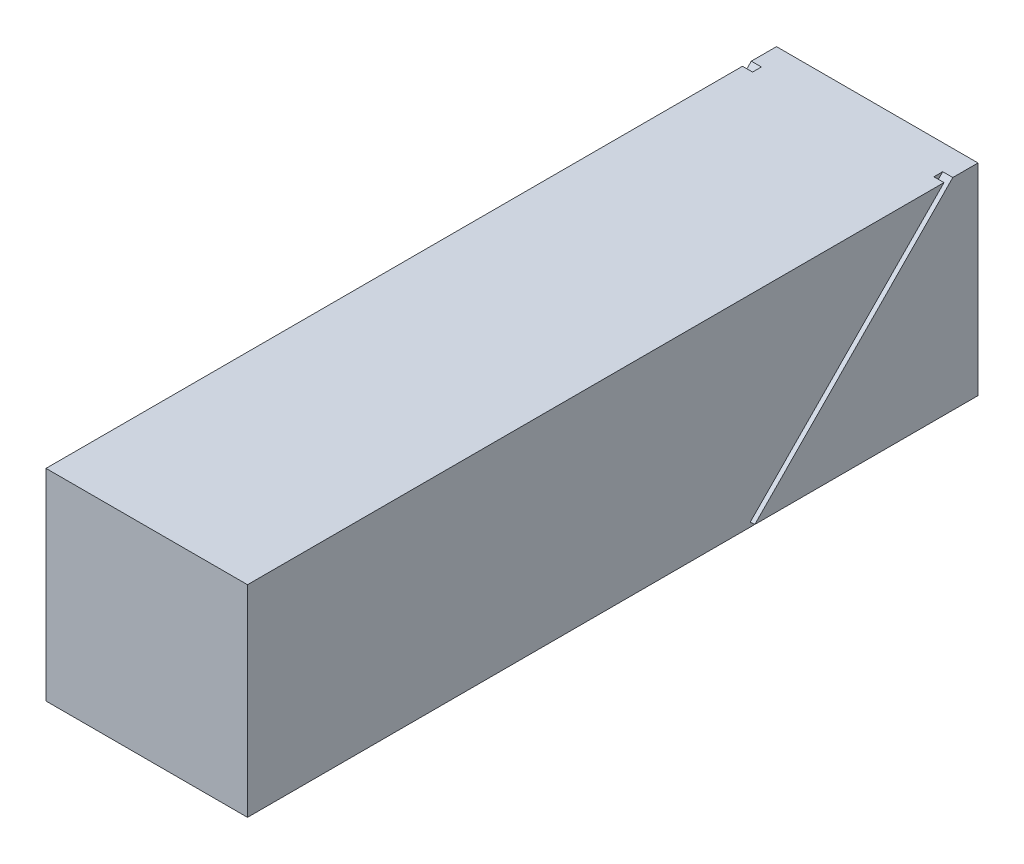
ISO-10303-21;
HEADER;
FILE_DESCRIPTION(('STEP AP214'),'2;1');
FILE_NAME('part.step','',(''),(''),'','','');
FILE_SCHEMA(('AUTOMOTIVE_DESIGN { 1 0 10303 214 1 1 1 1 }'));
ENDSEC;
DATA;
#1=APPLICATION_CONTEXT('core data for automotive mechanical design processes');
#2=APPLICATION_PROTOCOL_DEFINITION('international standard','automotive_design',2000,#1);
#3=PRODUCT_CONTEXT('',#1,'mechanical');
#4=PRODUCT('Part','Part','',(#3));
#5=PRODUCT_RELATED_PRODUCT_CATEGORY('part','',(#4));
#6=PRODUCT_DEFINITION_FORMATION('','',#4);
#7=PRODUCT_DEFINITION_CONTEXT('part definition',#1,'design');
#8=PRODUCT_DEFINITION('design','',#6,#7);
#9=PRODUCT_DEFINITION_SHAPE('','',#8);
#10=(LENGTH_UNIT() NAMED_UNIT(*) SI_UNIT(.MILLI.,.METRE.));
#11=(NAMED_UNIT(*) PLANE_ANGLE_UNIT() SI_UNIT($,.RADIAN.));
#12=(NAMED_UNIT(*) SI_UNIT($,.STERADIAN.) SOLID_ANGLE_UNIT());
#13=UNCERTAINTY_MEASURE_WITH_UNIT(LENGTH_MEASURE(1.E-05),#10,'distance_accuracy_value','');
#14=(GEOMETRIC_REPRESENTATION_CONTEXT(3) GLOBAL_UNCERTAINTY_ASSIGNED_CONTEXT((#13)) GLOBAL_UNIT_ASSIGNED_CONTEXT((#10,
#11,#12)) REPRESENTATION_CONTEXT('',''));
#15=CARTESIAN_POINT('',(0.,0.,0.));
#16=DIRECTION('',(0.,0.,1.));
#17=DIRECTION('',(1.,0.,0.));
#18=AXIS2_PLACEMENT_3D('',#15,#16,#17);
#19=CARTESIAN_POINT('',(0.,0.,184.15));
#20=DIRECTION('',(1.,0.,0.));
#21=DIRECTION('',(0.,0.,-1.));
#22=AXIS2_PLACEMENT_3D('',#19,#20,#21);
#23=PLANE('',#22);
#24=DIRECTION('',(0.,0.713250449154183,-0.700909264299849));
#25=VECTOR('',#24,1.);
#26=CARTESIAN_POINT('',(0.,-63.9297512229103,119.094612524697));
#27=LINE('',#26,#25);
#28=CARTESIAN_POINT('',(0.,-2.4980018054066E-13,56.2710209662771));
#29=VERTEX_POINT('',#28);
#30=CARTESIAN_POINT('',(0.,50.8,6.35000000000002));
#31=VERTEX_POINT('',#30);
#32=EDGE_CURVE('E164',#29,#31,#27,.T.);
#33=ORIENTED_EDGE('',*,*,#32,.T.);
#34=DIRECTION('',(0.,0.,-1.));
#35=VECTOR('',#34,1.);
#36=CARTESIAN_POINT('',(0.,50.8,184.15));
#37=LINE('',#36,#35);
#38=CARTESIAN_POINT('',(0.,50.8,0.));
#39=VERTEX_POINT('',#38);
#40=EDGE_CURVE('E247',#31,#39,#37,.T.);
#41=ORIENTED_EDGE('',*,*,#40,.T.);
#42=DIRECTION('',(0.,-1.,0.));
#43=VECTOR('',#42,1.);
#44=CARTESIAN_POINT('',(0.,0.,0.));
#45=LINE('',#44,#43);
#46=CARTESIAN_POINT('',(0.,0.,0.));
#47=VERTEX_POINT('',#46);
#48=EDGE_CURVE('E226',#39,#47,#45,.T.);
#49=ORIENTED_EDGE('',*,*,#48,.T.);
#50=DIRECTION('',(0.,0.,-1.));
#51=VECTOR('',#50,1.);
#52=CARTESIAN_POINT('',(0.,0.,184.15));
#53=LINE('',#52,#51);
#54=EDGE_CURVE('E43',#29,#47,#53,.T.);
#55=ORIENTED_EDGE('',*,*,#54,.F.);
#56=EDGE_LOOP('',(#33,#41,#49,#55));
#57=FACE_BOUND('',#56,.T.);
#58=ADVANCED_FACE('F36',(#57),#23,.F.);
#59=DIRECTION('',(0.,-0.713250449154183,0.700909264299849));
#60=VECTOR('',#59,1.);
#61=CARTESIAN_POINT('',(0.,-62.8170577658343,120.22689761273));
#62=LINE('',#61,#60);
#63=CARTESIAN_POINT('',(0.,50.8,8.57572590298757));
#64=VERTEX_POINT('',#63);
#65=CARTESIAN_POINT('',(0.,1.11269345707603,57.4033060543091));
#66=VERTEX_POINT('',#65);
#67=EDGE_CURVE('E185',#64,#66,#62,.T.);
#68=ORIENTED_EDGE('',*,*,#67,.T.);
#69=DIRECTION('',(0.,-0.70090926429985,-0.713250449154182));
#70=VECTOR('',#69,1.);
#71=CARTESIAN_POINT('',(0.,63.9297512229103,121.326408441579));
#72=LINE('',#71,#70);
#73=CARTESIAN_POINT('',(0.,0.254000000000018,56.5294932440917));
#74=VERTEX_POINT('',#73);
#75=EDGE_CURVE('E175',#66,#74,#72,.T.);
#76=ORIENTED_EDGE('',*,*,#75,.T.);
#77=DIRECTION('',(0.,-1.,1.09273919746571E-13));
#78=VECTOR('',#77,1.);
#79=CARTESIAN_POINT('',(0.,-1.39455930132618E-11,56.5294932440917));
#80=LINE('',#79,#78);
#81=CARTESIAN_POINT('',(0.,-5.03762899003748E-13,56.5294932440917));
#82=VERTEX_POINT('',#81);
#83=EDGE_CURVE('E172',#74,#82,#80,.T.);
#84=ORIENTED_EDGE('',*,*,#83,.T.);
#85=CARTESIAN_POINT('',(0.,0.,184.15));
#86=VERTEX_POINT('',#85);
#87=EDGE_CURVE('E11',#86,#82,#53,.T.);
#88=ORIENTED_EDGE('',*,*,#87,.F.);
#89=DIRECTION('',(0.,-1.,0.));
#90=VECTOR('',#89,1.);
#91=CARTESIAN_POINT('',(0.,0.,184.15));
#92=LINE('',#91,#90);
#93=CARTESIAN_POINT('',(0.,50.8,184.15));
#94=VERTEX_POINT('',#93);
#95=EDGE_CURVE('E237',#94,#86,#92,.T.);
#96=ORIENTED_EDGE('',*,*,#95,.F.);
#97=EDGE_CURVE('E258',#94,#64,#37,.T.);
#98=ORIENTED_EDGE('',*,*,#97,.T.);
#99=EDGE_LOOP('',(#68,#76,#84,#88,#96,#98));
#100=FACE_BOUND('',#99,.T.);
#101=ADVANCED_FACE('F311',(#100),#23,.F.);
#102=CARTESIAN_POINT('',(0.,0.,184.15));
#103=DIRECTION('',(0.,1.,0.));
#104=DIRECTION('',(0.,0.,1.));
#105=AXIS2_PLACEMENT_3D('',#102,#103,#104);
#106=PLANE('',#105);
#107=DIRECTION('',(-1.,0.,0.));
#108=VECTOR('',#107,1.);
#109=CARTESIAN_POINT('',(2.54,-2.4980018054066E-13,56.2710209662771));
#110=LINE('',#109,#108);
#111=CARTESIAN_POINT('',(2.54,-2.4980018054066E-13,56.2710209662771));
#112=VERTEX_POINT('',#111);
#113=EDGE_CURVE('E161',#112,#29,#110,.T.);
#114=ORIENTED_EDGE('',*,*,#113,.T.);
#115=ORIENTED_EDGE('',*,*,#54,.T.);
#116=DIRECTION('',(1.,0.,0.));
#117=VECTOR('',#116,1.);
#118=CARTESIAN_POINT('',(0.,0.,0.));
#119=LINE('',#118,#117);
#120=CARTESIAN_POINT('',(50.8,0.,0.));
#121=VERTEX_POINT('',#120);
#122=EDGE_CURVE('E250',#47,#121,#119,.T.);
#123=ORIENTED_EDGE('',*,*,#122,.T.);
#124=DIRECTION('',(0.,0.,-1.));
#125=VECTOR('',#124,1.);
#126=CARTESIAN_POINT('',(50.8,0.,184.15));
#127=LINE('',#126,#125);
#128=CARTESIAN_POINT('',(50.8,0.,56.2710209662768));
#129=VERTEX_POINT('',#128);
#130=EDGE_CURVE('E264',#129,#121,#127,.T.);
#131=ORIENTED_EDGE('',*,*,#130,.F.);
#132=DIRECTION('',(1.,0.,0.));
#133=VECTOR('',#132,1.);
#134=CARTESIAN_POINT('',(48.26,0.,56.2710209662768));
#135=LINE('',#134,#133);
#136=CARTESIAN_POINT('',(48.26,0.,56.2710209662768));
#137=VERTEX_POINT('',#136);
#138=EDGE_CURVE('E214',#137,#129,#135,.T.);
#139=ORIENTED_EDGE('',*,*,#138,.F.);
#140=DIRECTION('',(0.,0.,-1.));
#141=VECTOR('',#140,1.);
#142=CARTESIAN_POINT('',(48.26,0.,56.5294932440917));
#143=LINE('',#142,#141);
#144=CARTESIAN_POINT('',(48.26,0.,56.5294932440917));
#145=VERTEX_POINT('',#144);
#146=EDGE_CURVE('E199',#145,#137,#143,.T.);
#147=ORIENTED_EDGE('',*,*,#146,.F.);
#148=DIRECTION('',(1.,0.,0.));
#149=VECTOR('',#148,1.);
#150=CARTESIAN_POINT('',(48.26,0.,56.5294932440917));
#151=LINE('',#150,#149);
#152=CARTESIAN_POINT('',(50.8,0.,56.5294932440917));
#153=VERTEX_POINT('',#152);
#154=EDGE_CURVE('E223',#145,#153,#151,.T.);
#155=ORIENTED_EDGE('',*,*,#154,.T.);
#156=CARTESIAN_POINT('',(50.8,0.,184.15));
#157=VERTEX_POINT('',#156);
#158=EDGE_CURVE('E265',#157,#153,#127,.T.);
#159=ORIENTED_EDGE('',*,*,#158,.F.);
#160=DIRECTION('',(1.,0.,0.));
#161=VECTOR('',#160,1.);
#162=CARTESIAN_POINT('',(0.,0.,184.15));
#163=LINE('',#162,#161);
#164=EDGE_CURVE('E240',#86,#157,#163,.T.);
#165=ORIENTED_EDGE('',*,*,#164,.F.);
#166=ORIENTED_EDGE('',*,*,#87,.T.);
#167=DIRECTION('',(-1.,0.,0.));
#168=VECTOR('',#167,1.);
#169=CARTESIAN_POINT('',(2.54,-5.03762899003748E-13,56.5294932440917));
#170=LINE('',#169,#168);
#171=CARTESIAN_POINT('',(2.54,-5.03762899003748E-13,56.5294932440917));
#172=VERTEX_POINT('',#171);
#173=EDGE_CURVE('E171',#172,#82,#170,.T.);
#174=ORIENTED_EDGE('',*,*,#173,.F.);
#175=DIRECTION('',(0.,0.,-1.));
#176=VECTOR('',#175,1.);
#177=CARTESIAN_POINT('',(2.54,0.,184.15));
#178=LINE('',#177,#176);
#179=EDGE_CURVE('E153',#172,#112,#178,.T.);
#180=ORIENTED_EDGE('',*,*,#179,.T.);
#181=EDGE_LOOP('',(#114,#115,#123,#131,#139,#147,#155,#159,#165,#166,#174,#180));
#182=FACE_BOUND('',#181,.T.);
#183=ADVANCED_FACE('F170',(#182),#106,.F.);
#184=CARTESIAN_POINT('',(0.,50.8,184.15));
#185=DIRECTION('',(0.,-1.,0.));
#186=DIRECTION('',(0.,0.,-1.));
#187=AXIS2_PLACEMENT_3D('',#184,#185,#186);
#188=PLANE('',#187);
#189=DIRECTION('',(-1.,0.,0.));
#190=VECTOR('',#189,1.);
#191=CARTESIAN_POINT('',(2.54,50.8,6.35000000000002));
#192=LINE('',#191,#190);
#193=CARTESIAN_POINT('',(2.54,50.8,6.35000000000002));
#194=VERTEX_POINT('',#193);
#195=EDGE_CURVE('E168',#194,#31,#192,.T.);
#196=ORIENTED_EDGE('',*,*,#195,.F.);
#197=DIRECTION('',(0.,0.,1.));
#198=VECTOR('',#197,1.);
#199=CARTESIAN_POINT('',(2.54,50.8,184.15));
#200=LINE('',#199,#198);
#201=CARTESIAN_POINT('',(2.54,50.8,8.57572590298758));
#202=VERTEX_POINT('',#201);
#203=EDGE_CURVE('E156',#194,#202,#200,.T.);
#204=ORIENTED_EDGE('',*,*,#203,.T.);
#205=DIRECTION('',(-1.,0.,0.));
#206=VECTOR('',#205,1.);
#207=CARTESIAN_POINT('',(2.54,50.8,8.57572590298757));
#208=LINE('',#207,#206);
#209=EDGE_CURVE('E195',#202,#64,#208,.T.);
#210=ORIENTED_EDGE('',*,*,#209,.T.);
#211=ORIENTED_EDGE('',*,*,#97,.F.);
#212=DIRECTION('',(-1.,0.,0.));
#213=VECTOR('',#212,1.);
#214=CARTESIAN_POINT('',(0.,50.8,184.15));
#215=LINE('',#214,#213);
#216=CARTESIAN_POINT('',(50.8,50.8,184.15));
#217=VERTEX_POINT('',#216);
#218=EDGE_CURVE('E245',#217,#94,#215,.T.);
#219=ORIENTED_EDGE('',*,*,#218,.F.);
#220=DIRECTION('',(0.,0.,-1.));
#221=VECTOR('',#220,1.);
#222=CARTESIAN_POINT('',(50.8,50.8,184.15));
#223=LINE('',#222,#221);
#224=CARTESIAN_POINT('',(50.8,50.8,8.57572590298758));
#225=VERTEX_POINT('',#224);
#226=EDGE_CURVE('E262',#217,#225,#223,.T.);
#227=ORIENTED_EDGE('',*,*,#226,.T.);
#228=DIRECTION('',(1.,0.,0.));
#229=VECTOR('',#228,1.);
#230=CARTESIAN_POINT('',(48.26,50.8,8.57572590298758));
#231=LINE('',#230,#229);
#232=CARTESIAN_POINT('',(48.26,50.8,8.57572590298758));
#233=VERTEX_POINT('',#232);
#234=EDGE_CURVE('E231',#233,#225,#231,.T.);
#235=ORIENTED_EDGE('',*,*,#234,.F.);
#236=DIRECTION('',(0.,0.,1.));
#237=VECTOR('',#236,1.);
#238=CARTESIAN_POINT('',(48.26,50.8,8.57572590298758));
#239=LINE('',#238,#237);
#240=CARTESIAN_POINT('',(48.26,50.8,6.34999999999999));
#241=VERTEX_POINT('',#240);
#242=EDGE_CURVE('E203',#241,#233,#239,.T.);
#243=ORIENTED_EDGE('',*,*,#242,.F.);
#244=DIRECTION('',(1.,0.,0.));
#245=VECTOR('',#244,1.);
#246=CARTESIAN_POINT('',(48.26,50.8,6.35));
#247=LINE('',#246,#245);
#248=CARTESIAN_POINT('',(50.8,50.8,6.35));
#249=VERTEX_POINT('',#248);
#250=EDGE_CURVE('E233',#241,#249,#247,.T.);
#251=ORIENTED_EDGE('',*,*,#250,.T.);
#252=CARTESIAN_POINT('',(50.8,50.8,0.));
#253=VERTEX_POINT('',#252);
#254=EDGE_CURVE('E261',#249,#253,#223,.T.);
#255=ORIENTED_EDGE('',*,*,#254,.T.);
#256=DIRECTION('',(-1.,0.,0.));
#257=VECTOR('',#256,1.);
#258=CARTESIAN_POINT('',(0.,50.8,0.));
#259=LINE('',#258,#257);
#260=EDGE_CURVE('E241',#253,#39,#259,.T.);
#261=ORIENTED_EDGE('',*,*,#260,.T.);
#262=ORIENTED_EDGE('',*,*,#40,.F.);
#263=EDGE_LOOP('',(#196,#204,#210,#211,#219,#227,#235,#243,#251,#255,#261,#262));
#264=FACE_BOUND('',#263,.T.);
#265=ADVANCED_FACE('F285',(#264),#188,.F.);
#266=CARTESIAN_POINT('',(50.8,0.,184.15));
#267=DIRECTION('',(-1.,0.,0.));
#268=DIRECTION('',(0.,0.,1.));
#269=AXIS2_PLACEMENT_3D('',#266,#267,#268);
#270=PLANE('',#269);
#271=ORIENTED_EDGE('',*,*,#158,.T.);
#272=DIRECTION('',(0.,-1.,1.09273919746571E-13));
#273=VECTOR('',#272,1.);
#274=CARTESIAN_POINT('',(50.8,0.254,56.5294932440917));
#275=LINE('',#274,#273);
#276=CARTESIAN_POINT('',(50.8,0.254,56.5294932440917));
#277=VERTEX_POINT('',#276);
#278=EDGE_CURVE('E201',#277,#153,#275,.T.);
#279=ORIENTED_EDGE('',*,*,#278,.F.);
#280=DIRECTION('',(0.,-0.70090926429985,-0.713250449154182));
#281=VECTOR('',#280,1.);
#282=CARTESIAN_POINT('',(50.8,0.254,56.5294932440917));
#283=LINE('',#282,#281);
#284=CARTESIAN_POINT('',(50.8,1.11269345707602,57.4033060543091));
#285=VERTEX_POINT('',#284);
#286=EDGE_CURVE('E219',#285,#277,#283,.T.);
#287=ORIENTED_EDGE('',*,*,#286,.F.);
#288=DIRECTION('',(0.,-0.713250449154183,0.700909264299849));
#289=VECTOR('',#288,1.);
#290=CARTESIAN_POINT('',(50.8,1.11269345707602,57.4033060543091));
#291=LINE('',#290,#289);
#292=EDGE_CURVE('E216',#225,#285,#291,.T.);
#293=ORIENTED_EDGE('',*,*,#292,.F.);
#294=ORIENTED_EDGE('',*,*,#226,.F.);
#295=DIRECTION('',(0.,1.,0.));
#296=VECTOR('',#295,1.);
#297=CARTESIAN_POINT('',(50.8,0.,184.15));
#298=LINE('',#297,#296);
#299=EDGE_CURVE('E243',#157,#217,#298,.T.);
#300=ORIENTED_EDGE('',*,*,#299,.F.);
#301=EDGE_LOOP('',(#271,#279,#287,#293,#294,#300));
#302=FACE_BOUND('',#301,.T.);
#303=ADVANCED_FACE('F297',(#302),#270,.F.);
#304=ORIENTED_EDGE('',*,*,#254,.F.);
#305=DIRECTION('',(0.,0.713250449154183,-0.700909264299849));
#306=VECTOR('',#305,1.);
#307=CARTESIAN_POINT('',(50.8,0.,56.2710209662768));
#308=LINE('',#307,#306);
#309=EDGE_CURVE('E167',#129,#249,#308,.T.);
#310=ORIENTED_EDGE('',*,*,#309,.F.);
#311=ORIENTED_EDGE('',*,*,#130,.T.);
#312=DIRECTION('',(0.,1.,0.));
#313=VECTOR('',#312,1.);
#314=CARTESIAN_POINT('',(50.8,0.,0.));
#315=LINE('',#314,#313);
#316=EDGE_CURVE('E253',#121,#253,#315,.T.);
#317=ORIENTED_EDGE('',*,*,#316,.T.);
#318=EDGE_LOOP('',(#304,#310,#311,#317));
#319=FACE_BOUND('',#318,.T.);
#320=ADVANCED_FACE('F275',(#319),#270,.F.);
#321=CARTESIAN_POINT('',(0.,0.,184.15));
#322=DIRECTION('',(0.,0.,-1.));
#323=DIRECTION('',(-1.,0.,0.));
#324=AXIS2_PLACEMENT_3D('',#321,#322,#323);
#325=PLANE('',#324);
#326=ORIENTED_EDGE('',*,*,#95,.T.);
#327=ORIENTED_EDGE('',*,*,#164,.T.);
#328=ORIENTED_EDGE('',*,*,#299,.T.);
#329=ORIENTED_EDGE('',*,*,#218,.T.);
#330=EDGE_LOOP('',(#326,#327,#328,#329));
#331=FACE_BOUND('',#330,.T.);
#332=ADVANCED_FACE('F307',(#331),#325,.F.);
#333=CARTESIAN_POINT('',(0.,0.,0.));
#334=DIRECTION('',(0.,0.,-1.));
#335=DIRECTION('',(-1.,0.,0.));
#336=AXIS2_PLACEMENT_3D('',#333,#334,#335);
#337=PLANE('',#336);
#338=ORIENTED_EDGE('',*,*,#48,.F.);
#339=ORIENTED_EDGE('',*,*,#260,.F.);
#340=ORIENTED_EDGE('',*,*,#316,.F.);
#341=ORIENTED_EDGE('',*,*,#122,.F.);
#342=EDGE_LOOP('',(#338,#339,#340,#341));
#343=FACE_BOUND('',#342,.T.);
#344=ADVANCED_FACE('F282',(#343),#337,.T.);
#345=CARTESIAN_POINT('',(48.26,0.254,56.5294932440917));
#346=DIRECTION('',(0.,1.09273919746571E-13,1.));
#347=DIRECTION('',(0.,-1.,1.09273919746571E-13));
#348=AXIS2_PLACEMENT_3D('',#345,#346,#347);
#349=PLANE('',#348);
#350=ORIENTED_EDGE('',*,*,#278,.T.);
#351=ORIENTED_EDGE('',*,*,#154,.F.);
#352=DIRECTION('',(0.,-1.,1.09273919746571E-13));
#353=VECTOR('',#352,1.);
#354=CARTESIAN_POINT('',(48.26,0.254,56.5294932440917));
#355=LINE('',#354,#353);
#356=CARTESIAN_POINT('',(48.26,0.254,56.5294932440917));
#357=VERTEX_POINT('',#356);
#358=EDGE_CURVE('E211',#357,#145,#355,.T.);
#359=ORIENTED_EDGE('',*,*,#358,.F.);
#360=DIRECTION('',(1.,0.,0.));
#361=VECTOR('',#360,1.);
#362=CARTESIAN_POINT('',(48.26,0.254,56.5294932440917));
#363=LINE('',#362,#361);
#364=EDGE_CURVE('E227',#357,#277,#363,.T.);
#365=ORIENTED_EDGE('',*,*,#364,.T.);
#366=EDGE_LOOP('',(#350,#351,#359,#365));
#367=FACE_BOUND('',#366,.T.);
#368=ADVANCED_FACE('F295',(#367),#349,.F.);
#369=CARTESIAN_POINT('',(48.26,0.254,56.5294932440917));
#370=DIRECTION('',(0.,-0.713250449154182,0.70090926429985));
#371=DIRECTION('',(0.,-0.70090926429985,-0.713250449154182));
#372=AXIS2_PLACEMENT_3D('',#369,#370,#371);
#373=PLANE('',#372);
#374=ORIENTED_EDGE('',*,*,#286,.T.);
#375=ORIENTED_EDGE('',*,*,#364,.F.);
#376=DIRECTION('',(0.,-0.70090926429985,-0.713250449154182));
#377=VECTOR('',#376,1.);
#378=CARTESIAN_POINT('',(48.26,0.254,56.5294932440917));
#379=LINE('',#378,#377);
#380=CARTESIAN_POINT('',(48.26,1.11269345707602,57.4033060543091));
#381=VERTEX_POINT('',#380);
#382=EDGE_CURVE('E208',#381,#357,#379,.T.);
#383=ORIENTED_EDGE('',*,*,#382,.F.);
#384=DIRECTION('',(1.,0.,0.));
#385=VECTOR('',#384,1.);
#386=CARTESIAN_POINT('',(48.26,1.11269345707602,57.4033060543091));
#387=LINE('',#386,#385);
#388=EDGE_CURVE('E229',#381,#285,#387,.T.);
#389=ORIENTED_EDGE('',*,*,#388,.T.);
#390=EDGE_LOOP('',(#374,#375,#383,#389));
#391=FACE_BOUND('',#390,.T.);
#392=ADVANCED_FACE('F301',(#391),#373,.F.);
#393=CARTESIAN_POINT('',(48.26,1.11269345707602,57.4033060543091));
#394=DIRECTION('',(0.,0.700909264299849,0.713250449154183));
#395=DIRECTION('',(0.,-0.713250449154183,0.700909264299849));
#396=AXIS2_PLACEMENT_3D('',#393,#394,#395);
#397=PLANE('',#396);
#398=ORIENTED_EDGE('',*,*,#292,.T.);
#399=ORIENTED_EDGE('',*,*,#388,.F.);
#400=DIRECTION('',(0.,-0.713250449154183,0.700909264299849));
#401=VECTOR('',#400,1.);
#402=CARTESIAN_POINT('',(48.26,1.11269345707602,57.4033060543091));
#403=LINE('',#402,#401);
#404=EDGE_CURVE('E205',#233,#381,#403,.T.);
#405=ORIENTED_EDGE('',*,*,#404,.F.);
#406=ORIENTED_EDGE('',*,*,#234,.T.);
#407=EDGE_LOOP('',(#398,#399,#405,#406));
#408=FACE_BOUND('',#407,.T.);
#409=ADVANCED_FACE('F303',(#408),#397,.F.);
#410=CARTESIAN_POINT('',(48.26,0.,56.2710209662768));
#411=DIRECTION('',(0.,-0.700909264299849,-0.713250449154183));
#412=DIRECTION('',(0.,0.713250449154183,-0.700909264299849));
#413=AXIS2_PLACEMENT_3D('',#410,#411,#412);
#414=PLANE('',#413);
#415=ORIENTED_EDGE('',*,*,#309,.T.);
#416=ORIENTED_EDGE('',*,*,#250,.F.);
#417=DIRECTION('',(0.,0.713250449154183,-0.700909264299849));
#418=VECTOR('',#417,1.);
#419=CARTESIAN_POINT('',(48.26,0.,56.2710209662768));
#420=LINE('',#419,#418);
#421=EDGE_CURVE('E58',#137,#241,#420,.T.);
#422=ORIENTED_EDGE('',*,*,#421,.F.);
#423=ORIENTED_EDGE('',*,*,#138,.T.);
#424=EDGE_LOOP('',(#415,#416,#422,#423));
#425=FACE_BOUND('',#424,.T.);
#426=ADVANCED_FACE('F289',(#425),#414,.F.);
#427=CARTESIAN_POINT('',(48.26,0.,0.));
#428=DIRECTION('',(-1.,0.,0.));
#429=DIRECTION('',(0.,0.,1.));
#430=AXIS2_PLACEMENT_3D('',#427,#428,#429);
#431=PLANE('',#430);
#432=ORIENTED_EDGE('',*,*,#146,.T.);
#433=ORIENTED_EDGE('',*,*,#421,.T.);
#434=ORIENTED_EDGE('',*,*,#242,.T.);
#435=ORIENTED_EDGE('',*,*,#404,.T.);
#436=ORIENTED_EDGE('',*,*,#382,.T.);
#437=ORIENTED_EDGE('',*,*,#358,.T.);
#438=EDGE_LOOP('',(#432,#433,#434,#435,#436,#437));
#439=FACE_BOUND('',#438,.T.);
#440=ADVANCED_FACE('F291',(#439),#431,.F.);
#441=CARTESIAN_POINT('',(2.54,-63.9297512229103,119.094612524697));
#442=DIRECTION('',(0.,0.700909264299849,0.713250449154183));
#443=DIRECTION('',(0.,-0.713250449154183,0.700909264299849));
#444=AXIS2_PLACEMENT_3D('',#441,#442,#443);
#445=PLANE('',#444);
#446=ORIENTED_EDGE('',*,*,#32,.F.);
#447=ORIENTED_EDGE('',*,*,#113,.F.);
#448=DIRECTION('',(0.,0.713250449154183,-0.700909264299849));
#449=VECTOR('',#448,1.);
#450=CARTESIAN_POINT('',(2.54,-63.9297512229103,119.094612524697));
#451=LINE('',#450,#449);
#452=EDGE_CURVE('E148',#112,#194,#451,.T.);
#453=ORIENTED_EDGE('',*,*,#452,.T.);
#454=ORIENTED_EDGE('',*,*,#195,.T.);
#455=EDGE_LOOP('',(#446,#447,#453,#454));
#456=FACE_BOUND('',#455,.T.);
#457=ADVANCED_FACE('F162',(#456),#445,.T.);
#458=CARTESIAN_POINT('',(2.54,-62.8170577658343,120.22689761273));
#459=DIRECTION('',(0.,-0.700909264299849,-0.713250449154183));
#460=DIRECTION('',(0.,0.713250449154183,-0.700909264299849));
#461=AXIS2_PLACEMENT_3D('',#458,#459,#460);
#462=PLANE('',#461);
#463=ORIENTED_EDGE('',*,*,#67,.F.);
#464=ORIENTED_EDGE('',*,*,#209,.F.);
#465=DIRECTION('',(0.,-0.713250449154183,0.700909264299849));
#466=VECTOR('',#465,1.);
#467=CARTESIAN_POINT('',(2.54,-62.8170577658343,120.22689761273));
#468=LINE('',#467,#466);
#469=CARTESIAN_POINT('',(2.54,1.11269345707603,57.4033060543091));
#470=VERTEX_POINT('',#469);
#471=EDGE_CURVE('E50',#202,#470,#468,.T.);
#472=ORIENTED_EDGE('',*,*,#471,.T.);
#473=DIRECTION('',(-1.,0.,0.));
#474=VECTOR('',#473,1.);
#475=CARTESIAN_POINT('',(2.54,1.11269345707603,57.4033060543091));
#476=LINE('',#475,#474);
#477=EDGE_CURVE('E193',#470,#66,#476,.T.);
#478=ORIENTED_EDGE('',*,*,#477,.T.);
#479=EDGE_LOOP('',(#463,#464,#472,#478));
#480=FACE_BOUND('',#479,.T.);
#481=ADVANCED_FACE('F321',(#480),#462,.T.);
#482=CARTESIAN_POINT('',(2.54,63.9297512229103,121.326408441579));
#483=DIRECTION('',(0.,0.713250449154182,-0.70090926429985));
#484=DIRECTION('',(0.,0.70090926429985,0.713250449154182));
#485=AXIS2_PLACEMENT_3D('',#482,#483,#484);
#486=PLANE('',#485);
#487=ORIENTED_EDGE('',*,*,#75,.F.);
#488=ORIENTED_EDGE('',*,*,#477,.F.);
#489=DIRECTION('',(0.,-0.70090926429985,-0.713250449154182));
#490=VECTOR('',#489,1.);
#491=CARTESIAN_POINT('',(2.54,63.9297512229103,121.326408441579));
#492=LINE('',#491,#490);
#493=CARTESIAN_POINT('',(2.54,0.254000000000018,56.5294932440917));
#494=VERTEX_POINT('',#493);
#495=EDGE_CURVE('E180',#470,#494,#492,.T.);
#496=ORIENTED_EDGE('',*,*,#495,.T.);
#497=DIRECTION('',(-1.,0.,0.));
#498=VECTOR('',#497,1.);
#499=CARTESIAN_POINT('',(2.54,0.254000000000018,56.5294932440917));
#500=LINE('',#499,#498);
#501=EDGE_CURVE('E191',#494,#74,#500,.T.);
#502=ORIENTED_EDGE('',*,*,#501,.T.);
#503=EDGE_LOOP('',(#487,#488,#496,#502));
#504=FACE_BOUND('',#503,.T.);
#505=ADVANCED_FACE('F319',(#504),#486,.T.);
#506=CARTESIAN_POINT('',(2.54,-1.39455930132618E-11,56.5294932440917));
#507=DIRECTION('',(0.,-1.09273919746571E-13,-1.));
#508=DIRECTION('',(0.,1.,-1.09273919746571E-13));
#509=AXIS2_PLACEMENT_3D('',#506,#507,#508);
#510=PLANE('',#509);
#511=ORIENTED_EDGE('',*,*,#83,.F.);
#512=ORIENTED_EDGE('',*,*,#501,.F.);
#513=DIRECTION('',(0.,-1.,1.09273919746571E-13));
#514=VECTOR('',#513,1.);
#515=CARTESIAN_POINT('',(2.54,-1.39455930132618E-11,56.5294932440917));
#516=LINE('',#515,#514);
#517=EDGE_CURVE('E182',#494,#172,#516,.T.);
#518=ORIENTED_EDGE('',*,*,#517,.T.);
#519=ORIENTED_EDGE('',*,*,#173,.T.);
#520=EDGE_LOOP('',(#511,#512,#518,#519));
#521=FACE_BOUND('',#520,.T.);
#522=ADVANCED_FACE('F316',(#521),#510,.T.);
#523=CARTESIAN_POINT('',(2.54,0.,0.));
#524=DIRECTION('',(-1.,0.,0.));
#525=DIRECTION('',(0.,0.,1.));
#526=AXIS2_PLACEMENT_3D('',#523,#524,#525);
#527=PLANE('',#526);
#528=ORIENTED_EDGE('',*,*,#179,.F.);
#529=ORIENTED_EDGE('',*,*,#517,.F.);
#530=ORIENTED_EDGE('',*,*,#495,.F.);
#531=ORIENTED_EDGE('',*,*,#471,.F.);
#532=ORIENTED_EDGE('',*,*,#203,.F.);
#533=ORIENTED_EDGE('',*,*,#452,.F.);
#534=EDGE_LOOP('',(#528,#529,#530,#531,#532,#533));
#535=FACE_BOUND('',#534,.T.);
#536=ADVANCED_FACE('F150',(#535),#527,.T.);
#537=CLOSED_SHELL('',(#58,#101,#183,#265,#303,#320,#332,#344,#368,#392,#409,#426,#440,#457,#481,
#505,#522,#536));
#538=MANIFOLD_SOLID_BREP('B2',#537);
#539=ADVANCED_BREP_SHAPE_REPRESENTATION('',(#18,#538),#14);
#540=SHAPE_DEFINITION_REPRESENTATION(#9,#539);
ENDSEC;
END-ISO-10303-21;
